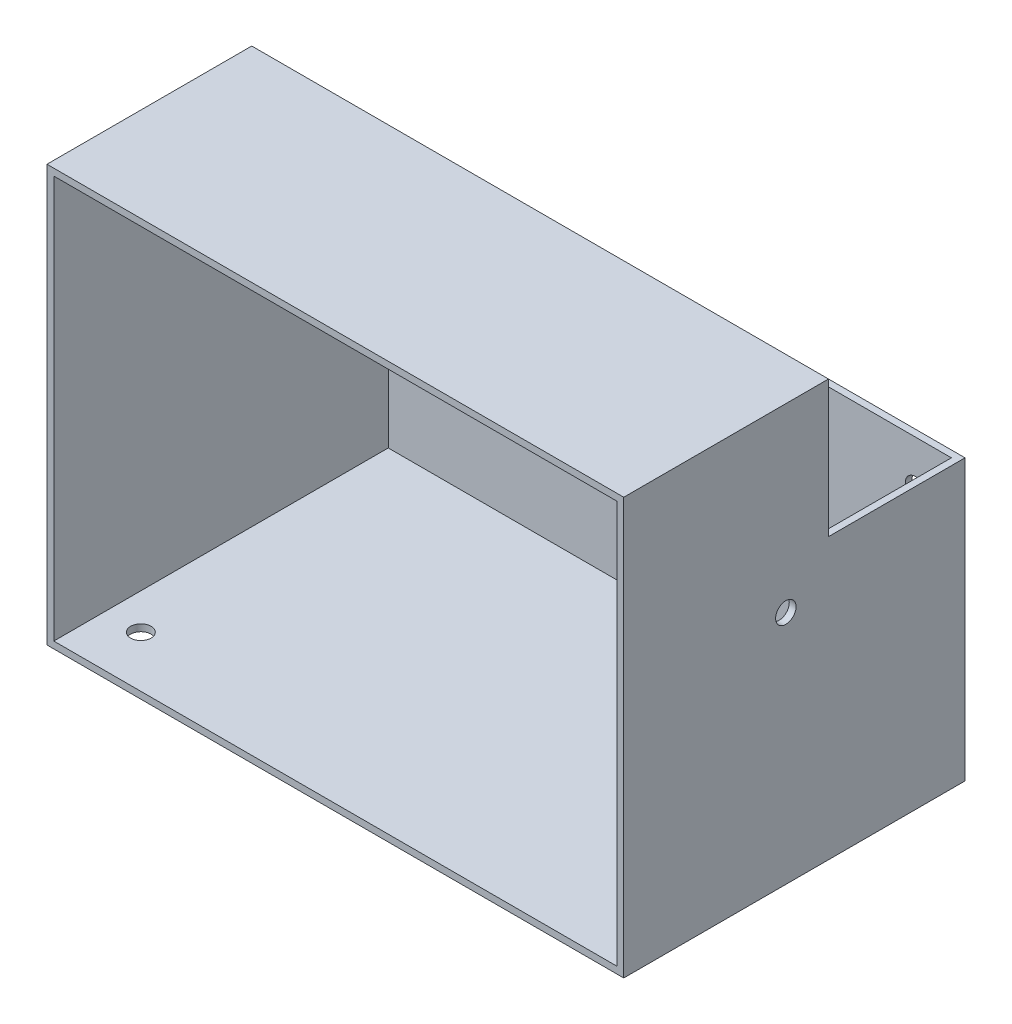
ISO-10303-21;
HEADER;
FILE_DESCRIPTION(('STEP AP214'),'2;1');
FILE_NAME('part.step','',(''),(''),'','','');
FILE_SCHEMA(('AUTOMOTIVE_DESIGN { 1 0 10303 214 1 1 1 1 }'));
ENDSEC;
DATA;
#1=APPLICATION_CONTEXT('core data for automotive mechanical design processes');
#2=APPLICATION_PROTOCOL_DEFINITION('international standard','automotive_design',2000,#1);
#3=PRODUCT_CONTEXT('',#1,'mechanical');
#4=PRODUCT('Part','Part','',(#3));
#5=PRODUCT_RELATED_PRODUCT_CATEGORY('part','',(#4));
#6=PRODUCT_DEFINITION_FORMATION('','',#4);
#7=PRODUCT_DEFINITION_CONTEXT('part definition',#1,'design');
#8=PRODUCT_DEFINITION('design','',#6,#7);
#9=PRODUCT_DEFINITION_SHAPE('','',#8);
#10=(LENGTH_UNIT() NAMED_UNIT(*) SI_UNIT(.MILLI.,.METRE.));
#11=(NAMED_UNIT(*) PLANE_ANGLE_UNIT() SI_UNIT($,.RADIAN.));
#12=(NAMED_UNIT(*) SI_UNIT($,.STERADIAN.) SOLID_ANGLE_UNIT());
#13=UNCERTAINTY_MEASURE_WITH_UNIT(LENGTH_MEASURE(1.E-05),#10,'distance_accuracy_value','');
#14=(GEOMETRIC_REPRESENTATION_CONTEXT(3) GLOBAL_UNCERTAINTY_ASSIGNED_CONTEXT((#13)) GLOBAL_UNIT_ASSIGNED_CONTEXT((#10,
#11,#12)) REPRESENTATION_CONTEXT('',''));
#15=CARTESIAN_POINT('',(0.,0.,0.));
#16=DIRECTION('',(0.,0.,1.));
#17=DIRECTION('',(1.,0.,0.));
#18=AXIS2_PLACEMENT_3D('',#15,#16,#17);
#19=CARTESIAN_POINT('',(-84.5,122.,-50.));
#20=DIRECTION('',(0.,0.,1.));
#21=DIRECTION('',(1.,0.,0.));
#22=AXIS2_PLACEMENT_3D('',#19,#20,#21);
#23=PLANE('',#22);
#24=DIRECTION('',(0.,-1.,0.));
#25=VECTOR('',#24,1.);
#26=CARTESIAN_POINT('',(-84.5,122.,-50.));
#27=LINE('',#26,#25);
#28=CARTESIAN_POINT('',(-84.5,82.,-50.));
#29=VERTEX_POINT('',#28);
#30=CARTESIAN_POINT('',(-84.5,0.,-50.));
#31=VERTEX_POINT('',#30);
#32=EDGE_CURVE('E250',#29,#31,#27,.T.);
#33=ORIENTED_EDGE('',*,*,#32,.F.);
#34=DIRECTION('',(1.,0.,0.));
#35=VECTOR('',#34,1.);
#36=CARTESIAN_POINT('',(-84.5,82.,-50.));
#37=LINE('',#36,#35);
#38=CARTESIAN_POINT('',(84.5,82.,-50.));
#39=VERTEX_POINT('',#38);
#40=EDGE_CURVE('E135',#29,#39,#37,.T.);
#41=ORIENTED_EDGE('',*,*,#40,.T.);
#42=DIRECTION('',(0.,-1.,0.));
#43=VECTOR('',#42,1.);
#44=CARTESIAN_POINT('',(84.5,122.,-50.));
#45=LINE('',#44,#43);
#46=CARTESIAN_POINT('',(84.5,0.,-50.));
#47=VERTEX_POINT('',#46);
#48=EDGE_CURVE('E253',#39,#47,#45,.T.);
#49=ORIENTED_EDGE('',*,*,#48,.T.);
#50=DIRECTION('',(-1.,0.,0.));
#51=VECTOR('',#50,1.);
#52=CARTESIAN_POINT('',(-84.5,0.,-50.));
#53=LINE('',#52,#51);
#54=EDGE_CURVE('E234',#47,#31,#53,.T.);
#55=ORIENTED_EDGE('',*,*,#54,.T.);
#56=EDGE_LOOP('',(#33,#41,#49,#55));
#57=FACE_BOUND('',#56,.T.);
#58=CARTESIAN_POINT('',(72.,69.,-50.));
#59=DIRECTION('',(0.,0.,1.));
#60=DIRECTION('',(1.,0.,0.));
#61=AXIS2_PLACEMENT_3D('',#58,#59,#60);
#62=CIRCLE('',#61,3.00000000000001);
#63=CARTESIAN_POINT('',(75.,69.,-50.));
#64=VERTEX_POINT('',#63);
#65=EDGE_CURVE('E334',#64,#64,#62,.F.);
#66=ORIENTED_EDGE('',*,*,#65,.F.);
#67=EDGE_LOOP('',(#66));
#68=FACE_BOUND('',#67,.T.);
#69=CARTESIAN_POINT('',(-72.,67.,-50.));
#70=DIRECTION('',(0.,0.,1.));
#71=DIRECTION('',(1.,0.,0.));
#72=AXIS2_PLACEMENT_3D('',#69,#70,#71);
#73=CIRCLE('',#72,3.00000000000001);
#74=CARTESIAN_POINT('',(-69.,67.,-50.));
#75=VERTEX_POINT('',#74);
#76=EDGE_CURVE('E339',#75,#75,#73,.T.);
#77=ORIENTED_EDGE('',*,*,#76,.T.);
#78=EDGE_LOOP('',(#77));
#79=FACE_BOUND('',#78,.T.);
#80=ADVANCED_FACE('F40',(#57,#68,#79),#23,.F.);
#81=CARTESIAN_POINT('',(0.,0.,-48.));
#82=DIRECTION('',(0.,0.,1.));
#83=DIRECTION('',(1.,0.,0.));
#84=AXIS2_PLACEMENT_3D('',#81,#82,#83);
#85=PLANE('',#84);
#86=CARTESIAN_POINT('',(72.,69.,-48.));
#87=DIRECTION('',(0.,0.,-1.));
#88=DIRECTION('',(-1.,0.,0.));
#89=AXIS2_PLACEMENT_3D('',#86,#87,#88);
#90=CIRCLE('',#89,3.00000000000001);
#91=CARTESIAN_POINT('',(69.,69.,-48.));
#92=VERTEX_POINT('',#91);
#93=EDGE_CURVE('E320',#92,#92,#90,.T.);
#94=ORIENTED_EDGE('',*,*,#93,.T.);
#95=EDGE_LOOP('',(#94));
#96=FACE_BOUND('',#95,.T.);
#97=DIRECTION('',(1.,0.,0.));
#98=VECTOR('',#97,1.);
#99=CARTESIAN_POINT('',(0.,82.,-48.));
#100=LINE('',#99,#98);
#101=CARTESIAN_POINT('',(-82.5,82.,-48.));
#102=VERTEX_POINT('',#101);
#103=CARTESIAN_POINT('',(82.5000000000001,82.,-48.));
#104=VERTEX_POINT('',#103);
#105=EDGE_CURVE('E50',#102,#104,#100,.T.);
#106=ORIENTED_EDGE('',*,*,#105,.F.);
#107=DIRECTION('',(0.,-1.,0.));
#108=VECTOR('',#107,1.);
#109=CARTESIAN_POINT('',(-82.5,120.,-48.));
#110=LINE('',#109,#108);
#111=CARTESIAN_POINT('',(-82.5,2.,-48.));
#112=VERTEX_POINT('',#111);
#113=EDGE_CURVE('E185',#102,#112,#110,.T.);
#114=ORIENTED_EDGE('',*,*,#113,.T.);
#115=DIRECTION('',(1.,0.,0.));
#116=VECTOR('',#115,1.);
#117=CARTESIAN_POINT('',(-82.5,2.,-48.));
#118=LINE('',#117,#116);
#119=CARTESIAN_POINT('',(82.5,2.,-48.));
#120=VERTEX_POINT('',#119);
#121=EDGE_CURVE('E189',#112,#120,#118,.T.);
#122=ORIENTED_EDGE('',*,*,#121,.T.);
#123=DIRECTION('',(0.,1.,0.));
#124=VECTOR('',#123,1.);
#125=CARTESIAN_POINT('',(82.5000000000001,120.,-48.));
#126=LINE('',#125,#124);
#127=EDGE_CURVE('E181',#120,#104,#126,.T.);
#128=ORIENTED_EDGE('',*,*,#127,.T.);
#129=EDGE_LOOP('',(#106,#114,#122,#128));
#130=FACE_BOUND('',#129,.T.);
#131=CARTESIAN_POINT('',(-72.,67.,-48.));
#132=DIRECTION('',(0.,0.,1.));
#133=DIRECTION('',(1.,0.,0.));
#134=AXIS2_PLACEMENT_3D('',#131,#132,#133);
#135=CIRCLE('',#134,3.00000000000001);
#136=CARTESIAN_POINT('',(-69.,67.,-48.));
#137=VERTEX_POINT('',#136);
#138=EDGE_CURVE('E325',#137,#137,#135,.T.);
#139=ORIENTED_EDGE('',*,*,#138,.F.);
#140=EDGE_LOOP('',(#139));
#141=FACE_BOUND('',#140,.T.);
#142=ADVANCED_FACE('F264',(#96,#130,#141),#85,.T.);
#143=CARTESIAN_POINT('',(84.5,122.,-50.));
#144=DIRECTION('',(-1.,0.,0.));
#145=DIRECTION('',(0.,0.,1.));
#146=AXIS2_PLACEMENT_3D('',#143,#144,#145);
#147=PLANE('',#146);
#148=CARTESIAN_POINT('',(84.5,69.,2.5));
#149=DIRECTION('',(1.,0.,0.));
#150=DIRECTION('',(0.,0.,-1.));
#151=AXIS2_PLACEMENT_3D('',#148,#149,#150);
#152=CIRCLE('',#151,3.);
#153=CARTESIAN_POINT('',(84.5,69.,-0.500000000000005));
#154=VERTEX_POINT('',#153);
#155=EDGE_CURVE('E321',#154,#154,#152,.T.);
#156=ORIENTED_EDGE('',*,*,#155,.F.);
#157=EDGE_LOOP('',(#156));
#158=FACE_BOUND('',#157,.T.);
#159=ORIENTED_EDGE('',*,*,#48,.F.);
#160=DIRECTION('',(0.,0.,-1.));
#161=VECTOR('',#160,1.);
#162=CARTESIAN_POINT('',(84.5,82.,-50.));
#163=LINE('',#162,#161);
#164=CARTESIAN_POINT('',(84.5,82.,-10.));
#165=VERTEX_POINT('',#164);
#166=EDGE_CURVE('E152',#165,#39,#163,.T.);
#167=ORIENTED_EDGE('',*,*,#166,.F.);
#168=DIRECTION('',(0.,-1.,0.));
#169=VECTOR('',#168,1.);
#170=CARTESIAN_POINT('',(84.5,122.,-10.));
#171=LINE('',#170,#169);
#172=CARTESIAN_POINT('',(84.5,122.,-10.));
#173=VERTEX_POINT('',#172);
#174=EDGE_CURVE('E155',#173,#165,#171,.T.);
#175=ORIENTED_EDGE('',*,*,#174,.F.);
#176=DIRECTION('',(0.,0.,-1.));
#177=VECTOR('',#176,1.);
#178=CARTESIAN_POINT('',(84.5,122.,-50.));
#179=LINE('',#178,#177);
#180=CARTESIAN_POINT('',(84.5,122.,50.));
#181=VERTEX_POINT('',#180);
#182=EDGE_CURVE('E220',#181,#173,#179,.T.);
#183=ORIENTED_EDGE('',*,*,#182,.F.);
#184=DIRECTION('',(0.,-1.,0.));
#185=VECTOR('',#184,1.);
#186=CARTESIAN_POINT('',(84.5,122.,50.));
#187=LINE('',#186,#185);
#188=CARTESIAN_POINT('',(84.5,0.,50.));
#189=VERTEX_POINT('',#188);
#190=EDGE_CURVE('E230',#181,#189,#187,.T.);
#191=ORIENTED_EDGE('',*,*,#190,.T.);
#192=DIRECTION('',(0.,0.,-1.));
#193=VECTOR('',#192,1.);
#194=CARTESIAN_POINT('',(84.5,0.,-50.));
#195=LINE('',#194,#193);
#196=EDGE_CURVE('E211',#189,#47,#195,.T.);
#197=ORIENTED_EDGE('',*,*,#196,.T.);
#198=EDGE_LOOP('',(#159,#167,#175,#183,#191,#197));
#199=FACE_BOUND('',#198,.T.);
#200=ADVANCED_FACE('F42',(#158,#199),#147,.F.);
#201=CARTESIAN_POINT('',(-84.5,122.,-50.));
#202=DIRECTION('',(1.,0.,0.));
#203=DIRECTION('',(0.,0.,-1.));
#204=AXIS2_PLACEMENT_3D('',#201,#202,#203);
#205=PLANE('',#204);
#206=DIRECTION('',(0.,-1.,0.));
#207=VECTOR('',#206,1.);
#208=CARTESIAN_POINT('',(-84.5,122.,-10.));
#209=LINE('',#208,#207);
#210=CARTESIAN_POINT('',(-84.5,122.,-10.));
#211=VERTEX_POINT('',#210);
#212=CARTESIAN_POINT('',(-84.5,82.,-10.));
#213=VERTEX_POINT('',#212);
#214=EDGE_CURVE('E57',#211,#213,#209,.T.);
#215=ORIENTED_EDGE('',*,*,#214,.T.);
#216=DIRECTION('',(0.,0.,-1.));
#217=VECTOR('',#216,1.);
#218=CARTESIAN_POINT('',(-84.5,82.,-50.));
#219=LINE('',#218,#217);
#220=EDGE_CURVE('E139',#213,#29,#219,.T.);
#221=ORIENTED_EDGE('',*,*,#220,.T.);
#222=ORIENTED_EDGE('',*,*,#32,.T.);
#223=DIRECTION('',(0.,0.,1.));
#224=VECTOR('',#223,1.);
#225=CARTESIAN_POINT('',(-84.5,0.,-50.));
#226=LINE('',#225,#224);
#227=CARTESIAN_POINT('',(-84.5,0.,50.));
#228=VERTEX_POINT('',#227);
#229=EDGE_CURVE('E238',#31,#228,#226,.T.);
#230=ORIENTED_EDGE('',*,*,#229,.T.);
#231=DIRECTION('',(0.,-1.,0.));
#232=VECTOR('',#231,1.);
#233=CARTESIAN_POINT('',(-84.5,122.,50.));
#234=LINE('',#233,#232);
#235=CARTESIAN_POINT('',(-84.5,122.,50.));
#236=VERTEX_POINT('',#235);
#237=EDGE_CURVE('E246',#236,#228,#234,.T.);
#238=ORIENTED_EDGE('',*,*,#237,.F.);
#239=DIRECTION('',(0.,0.,1.));
#240=VECTOR('',#239,1.);
#241=CARTESIAN_POINT('',(-84.5,122.,-50.));
#242=LINE('',#241,#240);
#243=EDGE_CURVE('E150',#211,#236,#242,.T.);
#244=ORIENTED_EDGE('',*,*,#243,.F.);
#245=EDGE_LOOP('',(#215,#221,#222,#230,#238,#244));
#246=FACE_BOUND('',#245,.T.);
#247=ADVANCED_FACE('F148',(#246),#205,.F.);
#248=CARTESIAN_POINT('',(-84.5,122.,50.));
#249=DIRECTION('',(0.,0.,-1.));
#250=DIRECTION('',(-1.,0.,0.));
#251=AXIS2_PLACEMENT_3D('',#248,#249,#250);
#252=PLANE('',#251);
#253=DIRECTION('',(-1.,0.,0.));
#254=VECTOR('',#253,1.);
#255=CARTESIAN_POINT('',(-82.5,120.,50.));
#256=LINE('',#255,#254);
#257=CARTESIAN_POINT('',(82.5,120.,50.));
#258=VERTEX_POINT('',#257);
#259=CARTESIAN_POINT('',(-82.5,120.,50.));
#260=VERTEX_POINT('',#259);
#261=EDGE_CURVE('E197',#258,#260,#256,.T.);
#262=ORIENTED_EDGE('',*,*,#261,.F.);
#263=DIRECTION('',(0.,1.,0.));
#264=VECTOR('',#263,1.);
#265=CARTESIAN_POINT('',(82.5000000000001,120.,50.));
#266=LINE('',#265,#264);
#267=CARTESIAN_POINT('',(82.5,2.,50.));
#268=VERTEX_POINT('',#267);
#269=EDGE_CURVE('E180',#268,#258,#266,.T.);
#270=ORIENTED_EDGE('',*,*,#269,.F.);
#271=DIRECTION('',(1.,0.,0.));
#272=VECTOR('',#271,1.);
#273=CARTESIAN_POINT('',(-82.5,2.,50.));
#274=LINE('',#273,#272);
#275=CARTESIAN_POINT('',(-82.5,2.,50.));
#276=VERTEX_POINT('',#275);
#277=EDGE_CURVE('E186',#276,#268,#274,.T.);
#278=ORIENTED_EDGE('',*,*,#277,.F.);
#279=DIRECTION('',(0.,-1.,0.));
#280=VECTOR('',#279,1.);
#281=CARTESIAN_POINT('',(-82.5,120.,50.));
#282=LINE('',#281,#280);
#283=EDGE_CURVE('E201',#260,#276,#282,.T.);
#284=ORIENTED_EDGE('',*,*,#283,.F.);
#285=EDGE_LOOP('',(#262,#270,#278,#284));
#286=FACE_BOUND('',#285,.T.);
#287=DIRECTION('',(1.,0.,0.));
#288=VECTOR('',#287,1.);
#289=CARTESIAN_POINT('',(-84.5,0.,50.));
#290=LINE('',#289,#288);
#291=EDGE_CURVE('E224',#228,#189,#290,.T.);
#292=ORIENTED_EDGE('',*,*,#291,.T.);
#293=ORIENTED_EDGE('',*,*,#190,.F.);
#294=DIRECTION('',(1.,0.,0.));
#295=VECTOR('',#294,1.);
#296=CARTESIAN_POINT('',(-84.5,122.,50.));
#297=LINE('',#296,#295);
#298=EDGE_CURVE('E227',#236,#181,#297,.T.);
#299=ORIENTED_EDGE('',*,*,#298,.F.);
#300=ORIENTED_EDGE('',*,*,#237,.T.);
#301=EDGE_LOOP('',(#292,#293,#299,#300));
#302=FACE_BOUND('',#301,.T.);
#303=ADVANCED_FACE('F275',(#286,#302),#252,.F.);
#304=CARTESIAN_POINT('',(0.,122.,0.));
#305=DIRECTION('',(0.,1.,0.));
#306=DIRECTION('',(0.,0.,1.));
#307=AXIS2_PLACEMENT_3D('',#304,#305,#306);
#308=PLANE('',#307);
#309=DIRECTION('',(1.,0.,0.));
#310=VECTOR('',#309,1.);
#311=CARTESIAN_POINT('',(-84.5,122.,-10.));
#312=LINE('',#311,#310);
#313=EDGE_CURVE('E145',#211,#173,#312,.T.);
#314=ORIENTED_EDGE('',*,*,#313,.F.);
#315=ORIENTED_EDGE('',*,*,#243,.T.);
#316=ORIENTED_EDGE('',*,*,#298,.T.);
#317=ORIENTED_EDGE('',*,*,#182,.T.);
#318=EDGE_LOOP('',(#314,#315,#316,#317));
#319=FACE_BOUND('',#318,.T.);
#320=ADVANCED_FACE('F304',(#319),#308,.T.);
#321=CARTESIAN_POINT('',(0.,0.,0.));
#322=DIRECTION('',(0.,1.,0.));
#323=DIRECTION('',(0.,0.,1.));
#324=AXIS2_PLACEMENT_3D('',#321,#322,#323);
#325=PLANE('',#324);
#326=CARTESIAN_POINT('',(-72.,0.,35.));
#327=DIRECTION('',(0.,1.,0.));
#328=DIRECTION('',(0.,0.,1.));
#329=AXIS2_PLACEMENT_3D('',#326,#327,#328);
#330=CIRCLE('',#329,3.00000000000001);
#331=CARTESIAN_POINT('',(-72.,0.,38.));
#332=VERTEX_POINT('',#331);
#333=EDGE_CURVE('E158',#332,#332,#330,.T.);
#334=ORIENTED_EDGE('',*,*,#333,.T.);
#335=EDGE_LOOP('',(#334));
#336=FACE_BOUND('',#335,.T.);
#337=CARTESIAN_POINT('',(72.0000000000001,0.,35.));
#338=DIRECTION('',(0.,1.,0.));
#339=DIRECTION('',(0.,0.,1.));
#340=AXIS2_PLACEMENT_3D('',#337,#338,#339);
#341=CIRCLE('',#340,3.00000000000001);
#342=CARTESIAN_POINT('',(72.0000000000001,0.,38.));
#343=VERTEX_POINT('',#342);
#344=EDGE_CURVE('E348',#343,#343,#341,.T.);
#345=ORIENTED_EDGE('',*,*,#344,.T.);
#346=EDGE_LOOP('',(#345));
#347=FACE_BOUND('',#346,.T.);
#348=ORIENTED_EDGE('',*,*,#196,.F.);
#349=ORIENTED_EDGE('',*,*,#291,.F.);
#350=ORIENTED_EDGE('',*,*,#229,.F.);
#351=ORIENTED_EDGE('',*,*,#54,.F.);
#352=EDGE_LOOP('',(#348,#349,#350,#351));
#353=FACE_BOUND('',#352,.T.);
#354=ADVANCED_FACE('F305',(#336,#347,#353),#325,.F.);
#355=CARTESIAN_POINT('',(82.5000000000001,120.,-48.));
#356=DIRECTION('',(1.,0.,0.));
#357=DIRECTION('',(0.,1.,0.));
#358=AXIS2_PLACEMENT_3D('',#355,#356,#357);
#359=PLANE('',#358);
#360=CARTESIAN_POINT('',(82.5,69.,2.5));
#361=DIRECTION('',(1.,0.,0.));
#362=DIRECTION('',(0.,1.,0.));
#363=AXIS2_PLACEMENT_3D('',#360,#361,#362);
#364=CIRCLE('',#363,3.);
#365=CARTESIAN_POINT('',(82.5,72.,2.5));
#366=VERTEX_POINT('',#365);
#367=EDGE_CURVE('E44',#366,#366,#364,.T.);
#368=ORIENTED_EDGE('',*,*,#367,.T.);
#369=EDGE_LOOP('',(#368));
#370=FACE_BOUND('',#369,.T.);
#371=DIRECTION('',(0.,-1.,0.));
#372=VECTOR('',#371,1.);
#373=CARTESIAN_POINT('',(82.5000000000001,120.,-10.));
#374=LINE('',#373,#372);
#375=CARTESIAN_POINT('',(82.5,120.,-10.));
#376=VERTEX_POINT('',#375);
#377=CARTESIAN_POINT('',(82.5,82.,-10.));
#378=VERTEX_POINT('',#377);
#379=EDGE_CURVE('E176',#376,#378,#374,.T.);
#380=ORIENTED_EDGE('',*,*,#379,.T.);
#381=DIRECTION('',(0.,0.,-1.));
#382=VECTOR('',#381,1.);
#383=CARTESIAN_POINT('',(82.5,82.,-48.));
#384=LINE('',#383,#382);
#385=EDGE_CURVE('E170',#378,#104,#384,.T.);
#386=ORIENTED_EDGE('',*,*,#385,.T.);
#387=ORIENTED_EDGE('',*,*,#127,.F.);
#388=DIRECTION('',(0.,0.,1.));
#389=VECTOR('',#388,1.);
#390=CARTESIAN_POINT('',(82.5,2.,-48.));
#391=LINE('',#390,#389);
#392=EDGE_CURVE('E208',#120,#268,#391,.T.);
#393=ORIENTED_EDGE('',*,*,#392,.T.);
#394=ORIENTED_EDGE('',*,*,#269,.T.);
#395=DIRECTION('',(0.,0.,1.));
#396=VECTOR('',#395,1.);
#397=CARTESIAN_POINT('',(82.5000000000001,120.,-48.));
#398=LINE('',#397,#396);
#399=EDGE_CURVE('E193',#376,#258,#398,.T.);
#400=ORIENTED_EDGE('',*,*,#399,.F.);
#401=EDGE_LOOP('',(#380,#386,#387,#393,#394,#400));
#402=FACE_BOUND('',#401,.T.);
#403=ADVANCED_FACE('F262',(#370,#402),#359,.F.);
#404=CARTESIAN_POINT('',(-82.5,2.,-48.));
#405=DIRECTION('',(0.,-1.,0.));
#406=DIRECTION('',(0.,0.,-1.));
#407=AXIS2_PLACEMENT_3D('',#404,#405,#406);
#408=PLANE('',#407);
#409=CARTESIAN_POINT('',(-72.,2.,35.));
#410=DIRECTION('',(0.,1.,0.));
#411=DIRECTION('',(0.,0.,1.));
#412=AXIS2_PLACEMENT_3D('',#409,#410,#411);
#413=CIRCLE('',#412,3.00000000000001);
#414=CARTESIAN_POINT('',(-72.,2.,38.));
#415=VERTEX_POINT('',#414);
#416=EDGE_CURVE('E344',#415,#415,#413,.T.);
#417=ORIENTED_EDGE('',*,*,#416,.F.);
#418=EDGE_LOOP('',(#417));
#419=FACE_BOUND('',#418,.T.);
#420=CARTESIAN_POINT('',(72.0000000000001,2.,35.));
#421=DIRECTION('',(0.,1.,0.));
#422=DIRECTION('',(0.,0.,-1.));
#423=AXIS2_PLACEMENT_3D('',#420,#421,#422);
#424=CIRCLE('',#423,3.00000000000001);
#425=CARTESIAN_POINT('',(72.0000000000001,2.,32.));
#426=VERTEX_POINT('',#425);
#427=EDGE_CURVE('E343',#426,#426,#424,.T.);
#428=ORIENTED_EDGE('',*,*,#427,.F.);
#429=EDGE_LOOP('',(#428));
#430=FACE_BOUND('',#429,.T.);
#431=ORIENTED_EDGE('',*,*,#277,.T.);
#432=ORIENTED_EDGE('',*,*,#392,.F.);
#433=ORIENTED_EDGE('',*,*,#121,.F.);
#434=DIRECTION('',(0.,0.,1.));
#435=VECTOR('',#434,1.);
#436=CARTESIAN_POINT('',(-82.5,2.,-48.));
#437=LINE('',#436,#435);
#438=EDGE_CURVE('E212',#112,#276,#437,.T.);
#439=ORIENTED_EDGE('',*,*,#438,.T.);
#440=EDGE_LOOP('',(#431,#432,#433,#439));
#441=FACE_BOUND('',#440,.T.);
#442=ADVANCED_FACE('F269',(#419,#430,#441),#408,.F.);
#443=CARTESIAN_POINT('',(-82.5,120.,-48.));
#444=DIRECTION('',(-1.,0.,0.));
#445=DIRECTION('',(0.,0.,1.));
#446=AXIS2_PLACEMENT_3D('',#443,#444,#445);
#447=PLANE('',#446);
#448=ORIENTED_EDGE('',*,*,#113,.F.);
#449=DIRECTION('',(0.,0.,1.));
#450=VECTOR('',#449,1.);
#451=CARTESIAN_POINT('',(-82.5,82.,-48.));
#452=LINE('',#451,#450);
#453=CARTESIAN_POINT('',(-82.5,82.,-10.));
#454=VERTEX_POINT('',#453);
#455=EDGE_CURVE('E65',#102,#454,#452,.T.);
#456=ORIENTED_EDGE('',*,*,#455,.T.);
#457=DIRECTION('',(0.,1.,0.));
#458=VECTOR('',#457,1.);
#459=CARTESIAN_POINT('',(-82.5,120.,-10.));
#460=LINE('',#459,#458);
#461=CARTESIAN_POINT('',(-82.5,120.,-10.));
#462=VERTEX_POINT('',#461);
#463=EDGE_CURVE('E133',#454,#462,#460,.T.);
#464=ORIENTED_EDGE('',*,*,#463,.T.);
#465=DIRECTION('',(0.,0.,1.));
#466=VECTOR('',#465,1.);
#467=CARTESIAN_POINT('',(-82.5,120.,-48.));
#468=LINE('',#467,#466);
#469=EDGE_CURVE('E215',#462,#260,#468,.T.);
#470=ORIENTED_EDGE('',*,*,#469,.T.);
#471=ORIENTED_EDGE('',*,*,#283,.T.);
#472=ORIENTED_EDGE('',*,*,#438,.F.);
#473=EDGE_LOOP('',(#448,#456,#464,#470,#471,#472));
#474=FACE_BOUND('',#473,.T.);
#475=ADVANCED_FACE('F281',(#474),#447,.F.);
#476=CARTESIAN_POINT('',(-82.5,120.,-48.));
#477=DIRECTION('',(0.,1.,0.));
#478=DIRECTION('',(0.,0.,1.));
#479=AXIS2_PLACEMENT_3D('',#476,#477,#478);
#480=PLANE('',#479);
#481=ORIENTED_EDGE('',*,*,#469,.F.);
#482=DIRECTION('',(1.,0.,0.));
#483=VECTOR('',#482,1.);
#484=CARTESIAN_POINT('',(-82.5,120.,-10.));
#485=LINE('',#484,#483);
#486=EDGE_CURVE('E12',#462,#376,#485,.T.);
#487=ORIENTED_EDGE('',*,*,#486,.T.);
#488=ORIENTED_EDGE('',*,*,#399,.T.);
#489=ORIENTED_EDGE('',*,*,#261,.T.);
#490=EDGE_LOOP('',(#481,#487,#488,#489));
#491=FACE_BOUND('',#490,.T.);
#492=ADVANCED_FACE('F279',(#491),#480,.F.);
#493=CARTESIAN_POINT('',(-84.5,122.,-10.));
#494=DIRECTION('',(0.,0.,1.));
#495=DIRECTION('',(0.,-1.,0.));
#496=AXIS2_PLACEMENT_3D('',#493,#494,#495);
#497=PLANE('',#496);
#498=ORIENTED_EDGE('',*,*,#486,.F.);
#499=ORIENTED_EDGE('',*,*,#463,.F.);
#500=DIRECTION('',(1.,0.,0.));
#501=VECTOR('',#500,1.);
#502=CARTESIAN_POINT('',(-84.5,82.,-10.));
#503=LINE('',#502,#501);
#504=EDGE_CURVE('E129',#213,#454,#503,.T.);
#505=ORIENTED_EDGE('',*,*,#504,.F.);
#506=ORIENTED_EDGE('',*,*,#214,.F.);
#507=ORIENTED_EDGE('',*,*,#313,.T.);
#508=ORIENTED_EDGE('',*,*,#174,.T.);
#509=EDGE_CURVE('E136',#378,#165,#503,.T.);
#510=ORIENTED_EDGE('',*,*,#509,.F.);
#511=ORIENTED_EDGE('',*,*,#379,.F.);
#512=EDGE_LOOP('',(#498,#499,#505,#506,#507,#508,#510,#511));
#513=FACE_BOUND('',#512,.T.);
#514=ADVANCED_FACE('F131',(#513),#497,.F.);
#515=CARTESIAN_POINT('',(-84.5,82.,-50.));
#516=DIRECTION('',(0.,-1.,0.));
#517=DIRECTION('',(0.,0.,-1.));
#518=AXIS2_PLACEMENT_3D('',#515,#516,#517);
#519=PLANE('',#518);
#520=ORIENTED_EDGE('',*,*,#509,.T.);
#521=ORIENTED_EDGE('',*,*,#166,.T.);
#522=ORIENTED_EDGE('',*,*,#40,.F.);
#523=ORIENTED_EDGE('',*,*,#220,.F.);
#524=ORIENTED_EDGE('',*,*,#504,.T.);
#525=ORIENTED_EDGE('',*,*,#455,.F.);
#526=ORIENTED_EDGE('',*,*,#105,.T.);
#527=ORIENTED_EDGE('',*,*,#385,.F.);
#528=EDGE_LOOP('',(#520,#521,#522,#523,#524,#525,#526,#527));
#529=FACE_BOUND('',#528,.T.);
#530=ADVANCED_FACE('F140',(#529),#519,.F.);
#531=CARTESIAN_POINT('',(72.0000000000001,-8.,35.));
#532=DIRECTION('',(0.,1.,0.));
#533=DIRECTION('',(0.,0.,1.));
#534=AXIS2_PLACEMENT_3D('',#531,#532,#533);
#535=CYLINDRICAL_SURFACE('',#534,3.00000000000001);
#536=ORIENTED_EDGE('',*,*,#427,.T.);
#537=EDGE_LOOP('',(#536));
#538=FACE_BOUND('',#537,.T.);
#539=ORIENTED_EDGE('',*,*,#344,.F.);
#540=EDGE_LOOP('',(#539));
#541=FACE_BOUND('',#540,.T.);
#542=ADVANCED_FACE('F362',(#538,#541),#535,.F.);
#543=CARTESIAN_POINT('',(-72.,-8.,35.));
#544=DIRECTION('',(0.,1.,0.));
#545=DIRECTION('',(0.,0.,1.));
#546=AXIS2_PLACEMENT_3D('',#543,#544,#545);
#547=CYLINDRICAL_SURFACE('',#546,3.00000000000001);
#548=ORIENTED_EDGE('',*,*,#416,.T.);
#549=EDGE_LOOP('',(#548));
#550=FACE_BOUND('',#549,.T.);
#551=ORIENTED_EDGE('',*,*,#333,.F.);
#552=EDGE_LOOP('',(#551));
#553=FACE_BOUND('',#552,.T.);
#554=ADVANCED_FACE('F359',(#550,#553),#547,.F.);
#555=CARTESIAN_POINT('',(72.,69.,-58.));
#556=DIRECTION('',(0.,0.,1.));
#557=DIRECTION('',(1.,0.,0.));
#558=AXIS2_PLACEMENT_3D('',#555,#556,#557);
#559=CYLINDRICAL_SURFACE('',#558,3.00000000000001);
#560=ORIENTED_EDGE('',*,*,#93,.F.);
#561=EDGE_LOOP('',(#560));
#562=FACE_BOUND('',#561,.T.);
#563=ORIENTED_EDGE('',*,*,#65,.T.);
#564=EDGE_LOOP('',(#563));
#565=FACE_BOUND('',#564,.T.);
#566=ADVANCED_FACE('F361',(#562,#565),#559,.F.);
#567=CARTESIAN_POINT('',(-72.,67.,-58.));
#568=DIRECTION('',(0.,0.,1.));
#569=DIRECTION('',(1.,0.,0.));
#570=AXIS2_PLACEMENT_3D('',#567,#568,#569);
#571=CYLINDRICAL_SURFACE('',#570,3.00000000000001);
#572=ORIENTED_EDGE('',*,*,#138,.T.);
#573=EDGE_LOOP('',(#572));
#574=FACE_BOUND('',#573,.T.);
#575=ORIENTED_EDGE('',*,*,#76,.F.);
#576=EDGE_LOOP('',(#575));
#577=FACE_BOUND('',#576,.T.);
#578=ADVANCED_FACE('F369',(#574,#577),#571,.F.);
#579=CARTESIAN_POINT('',(74.5,69.,2.5));
#580=DIRECTION('',(1.,0.,0.));
#581=DIRECTION('',(0.,0.,-1.));
#582=AXIS2_PLACEMENT_3D('',#579,#580,#581);
#583=CYLINDRICAL_SURFACE('',#582,3.);
#584=ORIENTED_EDGE('',*,*,#155,.T.);
#585=EDGE_LOOP('',(#584));
#586=FACE_BOUND('',#585,.T.);
#587=ORIENTED_EDGE('',*,*,#367,.F.);
#588=EDGE_LOOP('',(#587));
#589=FACE_BOUND('',#588,.T.);
#590=ADVANCED_FACE('F425',(#586,#589),#583,.F.);
#591=CLOSED_SHELL('',(#80,#142,#200,#247,#303,#320,#354,#403,#442,#475,#492,#514,#530,#542,#554,
#566,#578,#590));
#592=MANIFOLD_SOLID_BREP('B2',#591);
#593=ADVANCED_BREP_SHAPE_REPRESENTATION('',(#18,#592),#14);
#594=SHAPE_DEFINITION_REPRESENTATION(#9,#593);
ENDSEC;
END-ISO-10303-21;
